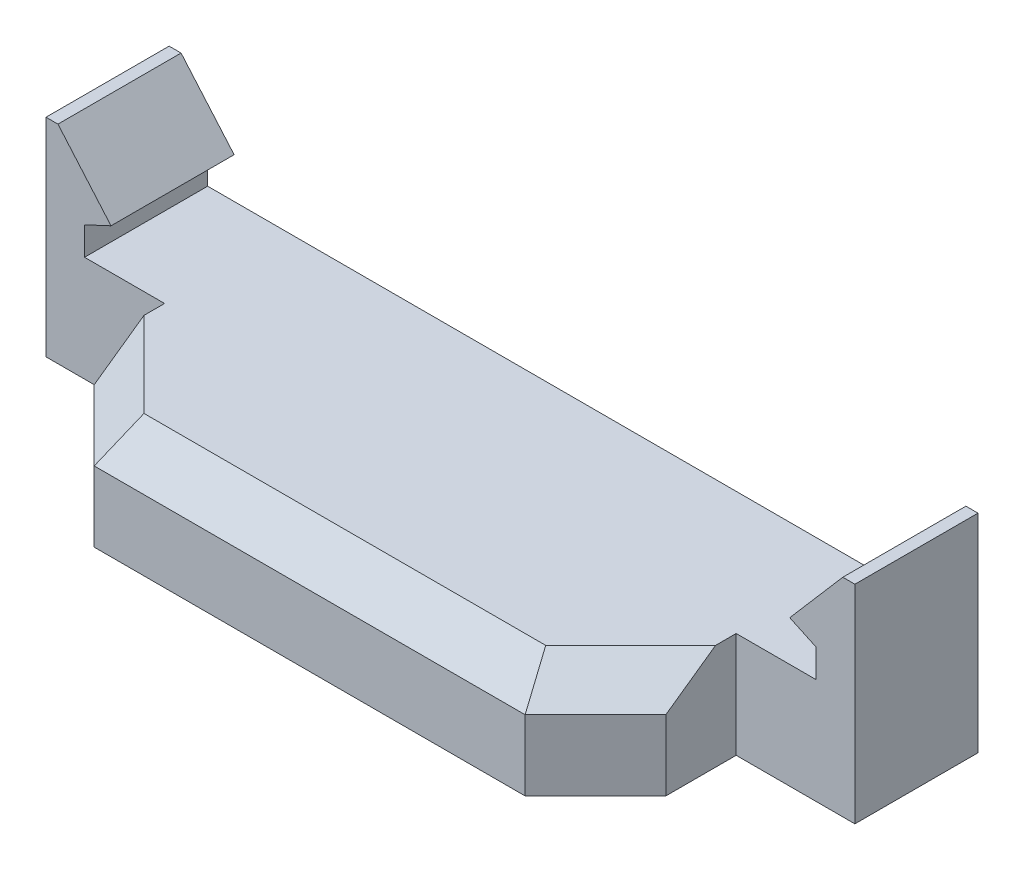
ISO-10303-21;
HEADER;
FILE_DESCRIPTION(('STEP AP214'),'2;1');
FILE_NAME('part.step','',(''),(''),'','','');
FILE_SCHEMA(('AUTOMOTIVE_DESIGN { 1 0 10303 214 1 1 1 1 }'));
ENDSEC;
DATA;
#1=APPLICATION_CONTEXT('core data for automotive mechanical design processes');
#2=APPLICATION_PROTOCOL_DEFINITION('international standard','automotive_design',2000,#1);
#3=PRODUCT_CONTEXT('',#1,'mechanical');
#4=PRODUCT('Part','Part','',(#3));
#5=PRODUCT_RELATED_PRODUCT_CATEGORY('part','',(#4));
#6=PRODUCT_DEFINITION_FORMATION('','',#4);
#7=PRODUCT_DEFINITION_CONTEXT('part definition',#1,'design');
#8=PRODUCT_DEFINITION('design','',#6,#7);
#9=PRODUCT_DEFINITION_SHAPE('','',#8);
#10=(LENGTH_UNIT() NAMED_UNIT(*) SI_UNIT(.MILLI.,.METRE.));
#11=(NAMED_UNIT(*) PLANE_ANGLE_UNIT() SI_UNIT($,.RADIAN.));
#12=(NAMED_UNIT(*) SI_UNIT($,.STERADIAN.) SOLID_ANGLE_UNIT());
#13=UNCERTAINTY_MEASURE_WITH_UNIT(LENGTH_MEASURE(1.E-05),#10,'distance_accuracy_value','');
#14=(GEOMETRIC_REPRESENTATION_CONTEXT(3) GLOBAL_UNCERTAINTY_ASSIGNED_CONTEXT((#13)) GLOBAL_UNIT_ASSIGNED_CONTEXT((#10,
#11,#12)) REPRESENTATION_CONTEXT('',''));
#15=CARTESIAN_POINT('',(0.,0.,0.));
#16=DIRECTION('',(0.,0.,1.));
#17=DIRECTION('',(1.,0.,0.));
#18=AXIS2_PLACEMENT_3D('',#15,#16,#17);
#19=CARTESIAN_POINT('',(0.,0.,3.5));
#20=DIRECTION('',(0.,0.,1.));
#21=DIRECTION('',(1.,0.,0.));
#22=AXIS2_PLACEMENT_3D('',#19,#20,#21);
#23=PLANE('',#22);
#24=DIRECTION('',(0.,1.,0.));
#25=VECTOR('',#24,1.);
#26=CARTESIAN_POINT('',(8.125,1.5,3.5));
#27=LINE('',#26,#25);
#28=CARTESIAN_POINT('',(8.125,-1.5,3.5));
#29=VERTEX_POINT('',#28);
#30=CARTESIAN_POINT('',(8.125,1.5,3.5));
#31=VERTEX_POINT('',#30);
#32=EDGE_CURVE('E212',#29,#31,#27,.T.);
#33=ORIENTED_EDGE('',*,*,#32,.F.);
#34=DIRECTION('',(1.,0.,0.));
#35=VECTOR('',#34,1.);
#36=CARTESIAN_POINT('',(0.,-1.5,3.5));
#37=LINE('',#36,#35);
#38=CARTESIAN_POINT('',(11.5,-1.5,3.5));
#39=VERTEX_POINT('',#38);
#40=EDGE_CURVE('E206',#29,#39,#37,.T.);
#41=ORIENTED_EDGE('',*,*,#40,.T.);
#42=DIRECTION('',(0.,-1.,0.));
#43=VECTOR('',#42,1.);
#44=CARTESIAN_POINT('',(11.5,4.40056886797164,3.5));
#45=LINE('',#44,#43);
#46=CARTESIAN_POINT('',(11.5,4.40056886797164,3.5));
#47=VERTEX_POINT('',#46);
#48=EDGE_CURVE('E249',#47,#39,#45,.T.);
#49=ORIENTED_EDGE('',*,*,#48,.F.);
#50=DIRECTION('',(1.,0.,0.));
#51=VECTOR('',#50,1.);
#52=CARTESIAN_POINT('',(0.,4.40056886797164,3.5));
#53=LINE('',#52,#51);
#54=CARTESIAN_POINT('',(11.1560620483073,4.40056886797164,3.5));
#55=VERTEX_POINT('',#54);
#56=EDGE_CURVE('E205',#55,#47,#53,.T.);
#57=ORIENTED_EDGE('',*,*,#56,.F.);
#58=DIRECTION('',(-0.652740475198616,-0.757581594310134,0.));
#59=VECTOR('',#58,1.);
#60=CARTESIAN_POINT('',(4.22669760880757,-3.64176826155107,3.5));
#61=LINE('',#60,#59);
#62=CARTESIAN_POINT('',(9.64823155059847,2.65055538511523,3.5));
#63=VERTEX_POINT('',#62);
#64=EDGE_CURVE('E257',#55,#63,#61,.T.);
#65=ORIENTED_EDGE('',*,*,#64,.T.);
#66=DIRECTION('',(0.906307787036653,-0.422618261740694,0.));
#67=VECTOR('',#66,1.);
#68=CARTESIAN_POINT('',(2.73845553921676,5.87263685535817,3.5));
#69=LINE('',#68,#67);
#70=CARTESIAN_POINT('',(10.4,2.3,3.5));
#71=VERTEX_POINT('',#70);
#72=EDGE_CURVE('E260',#63,#71,#69,.T.);
#73=ORIENTED_EDGE('',*,*,#72,.T.);
#74=DIRECTION('',(0.,-1.,0.));
#75=VECTOR('',#74,1.);
#76=CARTESIAN_POINT('',(10.4,0.,3.5));
#77=LINE('',#76,#75);
#78=CARTESIAN_POINT('',(10.4,1.5,3.5));
#79=VERTEX_POINT('',#78);
#80=EDGE_CURVE('E263',#71,#79,#77,.T.);
#81=ORIENTED_EDGE('',*,*,#80,.T.);
#82=DIRECTION('',(1.,0.,0.));
#83=VECTOR('',#82,1.);
#84=CARTESIAN_POINT('',(0.,1.5,3.5));
#85=LINE('',#84,#83);
#86=EDGE_CURVE('E267',#31,#79,#85,.T.);
#87=ORIENTED_EDGE('',*,*,#86,.F.);
#88=EDGE_LOOP('',(#33,#41,#49,#57,#65,#73,#81,#87));
#89=FACE_BOUND('',#88,.T.);
#90=ADVANCED_FACE('F41',(#89),#23,.T.);
#91=CARTESIAN_POINT('',(0.,-1.5,3.5));
#92=DIRECTION('',(0.,1.,0.));
#93=DIRECTION('',(0.,0.,1.));
#94=AXIS2_PLACEMENT_3D('',#91,#92,#93);
#95=PLANE('',#94);
#96=DIRECTION('',(1.,0.,0.));
#97=VECTOR('',#96,1.);
#98=CARTESIAN_POINT('',(-8.125,-1.5,7.5));
#99=LINE('',#98,#97);
#100=CARTESIAN_POINT('',(-6.125,-1.5,7.5));
#101=VERTEX_POINT('',#100);
#102=CARTESIAN_POINT('',(6.125,-1.5,7.5));
#103=VERTEX_POINT('',#102);
#104=EDGE_CURVE('E211',#101,#103,#99,.T.);
#105=ORIENTED_EDGE('',*,*,#104,.F.);
#106=DIRECTION('',(-0.707106781186546,0.,-0.707106781186549));
#107=VECTOR('',#106,1.);
#108=CARTESIAN_POINT('',(-6.125,-1.5,7.5));
#109=LINE('',#108,#107);
#110=CARTESIAN_POINT('',(-8.125,-1.5,5.49999999999999));
#111=VERTEX_POINT('',#110);
#112=EDGE_CURVE('E188',#101,#111,#109,.T.);
#113=ORIENTED_EDGE('',*,*,#112,.T.);
#114=DIRECTION('',(0.,0.,-1.));
#115=VECTOR('',#114,1.);
#116=CARTESIAN_POINT('',(-8.125,-1.5,7.5));
#117=LINE('',#116,#115);
#118=CARTESIAN_POINT('',(-8.125,-1.5,3.5));
#119=VERTEX_POINT('',#118);
#120=EDGE_CURVE('E181',#111,#119,#117,.T.);
#121=ORIENTED_EDGE('',*,*,#120,.T.);
#122=CARTESIAN_POINT('',(-11.496,-1.49999999999999,3.5));
#123=VERTEX_POINT('',#122);
#124=EDGE_CURVE('E186',#123,#119,#37,.T.);
#125=ORIENTED_EDGE('',*,*,#124,.F.);
#126=DIRECTION('',(0.,0.,1.));
#127=VECTOR('',#126,1.);
#128=CARTESIAN_POINT('',(-11.496,-1.49999999999999,0.));
#129=LINE('',#128,#127);
#130=CARTESIAN_POINT('',(-11.496,-1.49999999999999,0.));
#131=VERTEX_POINT('',#130);
#132=EDGE_CURVE('E234',#131,#123,#129,.T.);
#133=ORIENTED_EDGE('',*,*,#132,.F.);
#134=DIRECTION('',(1.,0.,0.));
#135=VECTOR('',#134,1.);
#136=CARTESIAN_POINT('',(0.,-1.5,0.));
#137=LINE('',#136,#135);
#138=CARTESIAN_POINT('',(11.5,-1.5,0.));
#139=VERTEX_POINT('',#138);
#140=EDGE_CURVE('E252',#131,#139,#137,.T.);
#141=ORIENTED_EDGE('',*,*,#140,.T.);
#142=DIRECTION('',(0.,0.,-1.));
#143=VECTOR('',#142,1.);
#144=CARTESIAN_POINT('',(11.5,-1.5,3.5));
#145=LINE('',#144,#143);
#146=EDGE_CURVE('E239',#39,#139,#145,.T.);
#147=ORIENTED_EDGE('',*,*,#146,.F.);
#148=ORIENTED_EDGE('',*,*,#40,.F.);
#149=DIRECTION('',(0.,0.,-1.));
#150=VECTOR('',#149,1.);
#151=CARTESIAN_POINT('',(8.125,-1.5,7.5));
#152=LINE('',#151,#150);
#153=CARTESIAN_POINT('',(8.125,-1.5,5.49999999999999));
#154=VERTEX_POINT('',#153);
#155=EDGE_CURVE('E193',#154,#29,#152,.T.);
#156=ORIENTED_EDGE('',*,*,#155,.F.);
#157=DIRECTION('',(-0.707106781186546,0.,0.707106781186549));
#158=VECTOR('',#157,1.);
#159=CARTESIAN_POINT('',(6.125,-1.5,7.5));
#160=LINE('',#159,#158);
#161=EDGE_CURVE('E354',#154,#103,#160,.T.);
#162=ORIENTED_EDGE('',*,*,#161,.T.);
#163=EDGE_LOOP('',(#105,#113,#121,#125,#133,#141,#147,#148,#156,#162));
#164=FACE_BOUND('',#163,.T.);
#165=ADVANCED_FACE('F184',(#164),#95,.F.);
#166=DIRECTION('',(0.,-1.,0.));
#167=VECTOR('',#166,1.);
#168=CARTESIAN_POINT('',(-8.125,1.5,3.5));
#169=LINE('',#168,#167);
#170=CARTESIAN_POINT('',(-8.125,1.5,3.5));
#171=VERTEX_POINT('',#170);
#172=EDGE_CURVE('E200',#171,#119,#169,.T.);
#173=ORIENTED_EDGE('',*,*,#172,.F.);
#174=CARTESIAN_POINT('',(-10.4,1.5,3.5));
#175=VERTEX_POINT('',#174);
#176=EDGE_CURVE('E268',#175,#171,#85,.T.);
#177=ORIENTED_EDGE('',*,*,#176,.F.);
#178=DIRECTION('',(0.,-1.,0.));
#179=VECTOR('',#178,1.);
#180=CARTESIAN_POINT('',(-10.4,0.,3.5));
#181=LINE('',#180,#179);
#182=CARTESIAN_POINT('',(-10.4,2.3,3.5));
#183=VERTEX_POINT('',#182);
#184=EDGE_CURVE('E271',#183,#175,#181,.T.);
#185=ORIENTED_EDGE('',*,*,#184,.F.);
#186=DIRECTION('',(-0.906307787036651,-0.422618261740697,0.));
#187=VECTOR('',#186,1.);
#188=CARTESIAN_POINT('',(-2.73845553921679,5.87263685535819,3.5));
#189=LINE('',#188,#187);
#190=CARTESIAN_POINT('',(-9.64823155059847,2.65055538511523,3.5));
#191=VERTEX_POINT('',#190);
#192=EDGE_CURVE('E275',#191,#183,#189,.T.);
#193=ORIENTED_EDGE('',*,*,#192,.F.);
#194=DIRECTION('',(0.652740475198616,-0.757581594310134,0.));
#195=VECTOR('',#194,1.);
#196=CARTESIAN_POINT('',(-4.22669760880758,-3.64176826155108,3.5));
#197=LINE('',#196,#195);
#198=CARTESIAN_POINT('',(-11.1560620483073,4.40056886797164,3.5));
#199=VERTEX_POINT('',#198);
#200=EDGE_CURVE('E279',#199,#191,#197,.T.);
#201=ORIENTED_EDGE('',*,*,#200,.F.);
#202=DIRECTION('',(-1.,0.,0.));
#203=VECTOR('',#202,1.);
#204=CARTESIAN_POINT('',(0.,4.40056886797155,3.5));
#205=LINE('',#204,#203);
#206=CARTESIAN_POINT('',(-11.496,4.40056886797165,3.5));
#207=VERTEX_POINT('',#206);
#208=EDGE_CURVE('E283',#199,#207,#205,.T.);
#209=ORIENTED_EDGE('',*,*,#208,.T.);
#210=DIRECTION('',(0.,1.,0.));
#211=VECTOR('',#210,1.);
#212=CARTESIAN_POINT('',(-11.496,-1.49999999999999,3.5));
#213=LINE('',#212,#211);
#214=EDGE_CURVE('E203',#123,#207,#213,.T.);
#215=ORIENTED_EDGE('',*,*,#214,.F.);
#216=ORIENTED_EDGE('',*,*,#124,.T.);
#217=EDGE_LOOP('',(#173,#177,#185,#193,#201,#209,#215,#216));
#218=FACE_BOUND('',#217,.T.);
#219=ADVANCED_FACE('F198',(#218),#23,.T.);
#220=CARTESIAN_POINT('',(0.,0.,0.));
#221=DIRECTION('',(0.,0.,1.));
#222=DIRECTION('',(1.,0.,0.));
#223=AXIS2_PLACEMENT_3D('',#220,#221,#222);
#224=PLANE('',#223);
#225=DIRECTION('',(0.,-1.,0.));
#226=VECTOR('',#225,1.);
#227=CARTESIAN_POINT('',(-11.496,4.40056886797165,0.));
#228=LINE('',#227,#226);
#229=CARTESIAN_POINT('',(-11.496,4.40056886797165,0.));
#230=VERTEX_POINT('',#229);
#231=EDGE_CURVE('E231',#230,#131,#228,.T.);
#232=ORIENTED_EDGE('',*,*,#231,.F.);
#233=DIRECTION('',(-1.,0.,0.));
#234=VECTOR('',#233,1.);
#235=CARTESIAN_POINT('',(0.,4.40056886797155,0.));
#236=LINE('',#235,#234);
#237=CARTESIAN_POINT('',(-11.1560620483073,4.40056886797164,0.));
#238=VERTEX_POINT('',#237);
#239=EDGE_CURVE('E319',#238,#230,#236,.T.);
#240=ORIENTED_EDGE('',*,*,#239,.F.);
#241=DIRECTION('',(0.652740475198616,-0.757581594310134,0.));
#242=VECTOR('',#241,1.);
#243=CARTESIAN_POINT('',(-4.22669760880758,-3.64176826155108,0.));
#244=LINE('',#243,#242);
#245=CARTESIAN_POINT('',(-9.64823155059847,2.65055538511523,0.));
#246=VERTEX_POINT('',#245);
#247=EDGE_CURVE('E315',#238,#246,#244,.T.);
#248=ORIENTED_EDGE('',*,*,#247,.T.);
#249=DIRECTION('',(-0.906307787036651,-0.422618261740697,0.));
#250=VECTOR('',#249,1.);
#251=CARTESIAN_POINT('',(-2.73845553921679,5.87263685535819,0.));
#252=LINE('',#251,#250);
#253=CARTESIAN_POINT('',(-10.4,2.3,0.));
#254=VERTEX_POINT('',#253);
#255=EDGE_CURVE('E311',#246,#254,#252,.T.);
#256=ORIENTED_EDGE('',*,*,#255,.T.);
#257=DIRECTION('',(0.,-1.,0.));
#258=VECTOR('',#257,1.);
#259=CARTESIAN_POINT('',(-10.4,0.,0.));
#260=LINE('',#259,#258);
#261=CARTESIAN_POINT('',(-10.4,1.5,0.));
#262=VERTEX_POINT('',#261);
#263=EDGE_CURVE('E307',#254,#262,#260,.T.);
#264=ORIENTED_EDGE('',*,*,#263,.T.);
#265=DIRECTION('',(1.,0.,0.));
#266=VECTOR('',#265,1.);
#267=CARTESIAN_POINT('',(0.,1.5,0.));
#268=LINE('',#267,#266);
#269=CARTESIAN_POINT('',(10.4,1.5,0.));
#270=VERTEX_POINT('',#269);
#271=EDGE_CURVE('E303',#262,#270,#268,.T.);
#272=ORIENTED_EDGE('',*,*,#271,.T.);
#273=DIRECTION('',(0.,-1.,0.));
#274=VECTOR('',#273,1.);
#275=CARTESIAN_POINT('',(10.4,0.,0.));
#276=LINE('',#275,#274);
#277=CARTESIAN_POINT('',(10.4,2.3,0.));
#278=VERTEX_POINT('',#277);
#279=EDGE_CURVE('E299',#278,#270,#276,.T.);
#280=ORIENTED_EDGE('',*,*,#279,.F.);
#281=DIRECTION('',(0.906307787036653,-0.422618261740694,0.));
#282=VECTOR('',#281,1.);
#283=CARTESIAN_POINT('',(2.73845553921676,5.87263685535817,0.));
#284=LINE('',#283,#282);
#285=CARTESIAN_POINT('',(9.64823155059847,2.65055538511523,0.));
#286=VERTEX_POINT('',#285);
#287=EDGE_CURVE('E296',#286,#278,#284,.T.);
#288=ORIENTED_EDGE('',*,*,#287,.F.);
#289=DIRECTION('',(-0.652740475198616,-0.757581594310134,0.));
#290=VECTOR('',#289,1.);
#291=CARTESIAN_POINT('',(4.22669760880757,-3.64176826155107,0.));
#292=LINE('',#291,#290);
#293=CARTESIAN_POINT('',(11.1560620483073,4.40056886797164,0.));
#294=VERTEX_POINT('',#293);
#295=EDGE_CURVE('E293',#294,#286,#292,.T.);
#296=ORIENTED_EDGE('',*,*,#295,.F.);
#297=DIRECTION('',(1.,0.,0.));
#298=VECTOR('',#297,1.);
#299=CARTESIAN_POINT('',(0.,4.40056886797164,0.));
#300=LINE('',#299,#298);
#301=CARTESIAN_POINT('',(11.5,4.40056886797164,0.));
#302=VERTEX_POINT('',#301);
#303=EDGE_CURVE('E289',#294,#302,#300,.T.);
#304=ORIENTED_EDGE('',*,*,#303,.T.);
#305=DIRECTION('',(0.,1.,0.));
#306=VECTOR('',#305,1.);
#307=CARTESIAN_POINT('',(11.5,-1.5,0.));
#308=LINE('',#307,#306);
#309=EDGE_CURVE('E243',#139,#302,#308,.T.);
#310=ORIENTED_EDGE('',*,*,#309,.F.);
#311=ORIENTED_EDGE('',*,*,#140,.F.);
#312=EDGE_LOOP('',(#232,#240,#248,#256,#264,#272,#280,#288,#296,#304,#310,#311));
#313=FACE_BOUND('',#312,.T.);
#314=ADVANCED_FACE('F425',(#313),#224,.F.);
#315=CARTESIAN_POINT('',(0.,4.40056886797155,3.5));
#316=DIRECTION('',(0.,-1.,0.));
#317=DIRECTION('',(1.,0.,0.));
#318=AXIS2_PLACEMENT_3D('',#315,#316,#317);
#319=PLANE('',#318);
#320=DIRECTION('',(0.,0.,-1.));
#321=VECTOR('',#320,1.);
#322=CARTESIAN_POINT('',(-11.496,4.40056886797165,3.5));
#323=LINE('',#322,#321);
#324=EDGE_CURVE('E228',#207,#230,#323,.T.);
#325=ORIENTED_EDGE('',*,*,#324,.F.);
#326=ORIENTED_EDGE('',*,*,#208,.F.);
#327=DIRECTION('',(0.,0.,-1.));
#328=VECTOR('',#327,1.);
#329=CARTESIAN_POINT('',(-11.1560620483073,4.40056886797164,3.5));
#330=LINE('',#329,#328);
#331=EDGE_CURVE('E286',#199,#238,#330,.T.);
#332=ORIENTED_EDGE('',*,*,#331,.T.);
#333=ORIENTED_EDGE('',*,*,#239,.T.);
#334=EDGE_LOOP('',(#325,#326,#332,#333));
#335=FACE_BOUND('',#334,.T.);
#336=ADVANCED_FACE('F419',(#335),#319,.F.);
#337=CARTESIAN_POINT('',(0.,4.40056886797164,3.5));
#338=DIRECTION('',(0.,1.,0.));
#339=DIRECTION('',(0.,0.,1.));
#340=AXIS2_PLACEMENT_3D('',#337,#338,#339);
#341=PLANE('',#340);
#342=ORIENTED_EDGE('',*,*,#56,.T.);
#343=DIRECTION('',(0.,0.,1.));
#344=VECTOR('',#343,1.);
#345=CARTESIAN_POINT('',(11.5,4.40056886797164,0.));
#346=LINE('',#345,#344);
#347=EDGE_CURVE('E246',#302,#47,#346,.T.);
#348=ORIENTED_EDGE('',*,*,#347,.F.);
#349=ORIENTED_EDGE('',*,*,#303,.F.);
#350=DIRECTION('',(0.,0.,-1.));
#351=VECTOR('',#350,1.);
#352=CARTESIAN_POINT('',(11.1560620483073,4.40056886797164,3.5));
#353=LINE('',#352,#351);
#354=EDGE_CURVE('E345',#55,#294,#353,.T.);
#355=ORIENTED_EDGE('',*,*,#354,.F.);
#356=EDGE_LOOP('',(#342,#348,#349,#355));
#357=FACE_BOUND('',#356,.T.);
#358=ADVANCED_FACE('F437',(#357),#341,.T.);
#359=CARTESIAN_POINT('',(4.22669760880757,-3.64176826155107,3.5));
#360=DIRECTION('',(0.757581594310134,-0.652740475198616,0.));
#361=DIRECTION('',(0.652740475198616,0.757581594310135,0.));
#362=AXIS2_PLACEMENT_3D('',#359,#360,#361);
#363=PLANE('',#362);
#364=ORIENTED_EDGE('',*,*,#295,.T.);
#365=DIRECTION('',(0.,0.,-1.));
#366=VECTOR('',#365,1.);
#367=CARTESIAN_POINT('',(9.64823155059847,2.65055538511523,3.5));
#368=LINE('',#367,#366);
#369=EDGE_CURVE('E341',#63,#286,#368,.T.);
#370=ORIENTED_EDGE('',*,*,#369,.F.);
#371=ORIENTED_EDGE('',*,*,#64,.F.);
#372=ORIENTED_EDGE('',*,*,#354,.T.);
#373=EDGE_LOOP('',(#364,#370,#371,#372));
#374=FACE_BOUND('',#373,.T.);
#375=ADVANCED_FACE('F443',(#374),#363,.F.);
#376=CARTESIAN_POINT('',(2.73845553921676,5.87263685535817,3.5));
#377=DIRECTION('',(0.422618261740694,0.906307787036653,0.));
#378=DIRECTION('',(-0.906307787036653,0.422618261740694,0.));
#379=AXIS2_PLACEMENT_3D('',#376,#377,#378);
#380=PLANE('',#379);
#381=ORIENTED_EDGE('',*,*,#287,.T.);
#382=DIRECTION('',(0.,0.,-1.));
#383=VECTOR('',#382,1.);
#384=CARTESIAN_POINT('',(10.4,2.3,3.5));
#385=LINE('',#384,#383);
#386=EDGE_CURVE('E337',#71,#278,#385,.T.);
#387=ORIENTED_EDGE('',*,*,#386,.F.);
#388=ORIENTED_EDGE('',*,*,#72,.F.);
#389=ORIENTED_EDGE('',*,*,#369,.T.);
#390=EDGE_LOOP('',(#381,#387,#388,#389));
#391=FACE_BOUND('',#390,.T.);
#392=ADVANCED_FACE('F450',(#391),#380,.F.);
#393=CARTESIAN_POINT('',(10.4,0.,3.5));
#394=DIRECTION('',(1.,0.,0.));
#395=DIRECTION('',(0.,0.,-1.));
#396=AXIS2_PLACEMENT_3D('',#393,#394,#395);
#397=PLANE('',#396);
#398=ORIENTED_EDGE('',*,*,#279,.T.);
#399=DIRECTION('',(0.,0.,-1.));
#400=VECTOR('',#399,1.);
#401=CARTESIAN_POINT('',(10.4,1.5,3.5));
#402=LINE('',#401,#400);
#403=EDGE_CURVE('E334',#79,#270,#402,.T.);
#404=ORIENTED_EDGE('',*,*,#403,.F.);
#405=ORIENTED_EDGE('',*,*,#80,.F.);
#406=ORIENTED_EDGE('',*,*,#386,.T.);
#407=EDGE_LOOP('',(#398,#404,#405,#406));
#408=FACE_BOUND('',#407,.T.);
#409=ADVANCED_FACE('F454',(#408),#397,.F.);
#410=CARTESIAN_POINT('',(0.,1.5,3.5));
#411=DIRECTION('',(0.,1.,0.));
#412=DIRECTION('',(0.,0.,1.));
#413=AXIS2_PLACEMENT_3D('',#410,#411,#412);
#414=PLANE('',#413);
#415=DIRECTION('',(1.,0.,0.));
#416=VECTOR('',#415,1.);
#417=CARTESIAN_POINT('',(0.,1.5,6.49999999999999));
#418=LINE('',#417,#416);
#419=CARTESIAN_POINT('',(-5.7107864376269,1.5,6.49999999999999));
#420=VERTEX_POINT('',#419);
#421=CARTESIAN_POINT('',(5.7107864376269,1.5,6.49999999999999));
#422=VERTEX_POINT('',#421);
#423=EDGE_CURVE('E365',#420,#422,#418,.T.);
#424=ORIENTED_EDGE('',*,*,#423,.T.);
#425=DIRECTION('',(0.707106781186546,0.,-0.707106781186549));
#426=VECTOR('',#425,1.);
#427=CARTESIAN_POINT('',(4.35539321881345,1.5,7.85539321881344));
#428=LINE('',#427,#426);
#429=CARTESIAN_POINT('',(8.125,1.5,4.08578643762688));
#430=VERTEX_POINT('',#429);
#431=EDGE_CURVE('E371',#422,#430,#428,.T.);
#432=ORIENTED_EDGE('',*,*,#431,.T.);
#433=DIRECTION('',(0.,0.,-1.));
#434=VECTOR('',#433,1.);
#435=CARTESIAN_POINT('',(8.125,1.5,7.5));
#436=LINE('',#435,#434);
#437=EDGE_CURVE('E225',#430,#31,#436,.T.);
#438=ORIENTED_EDGE('',*,*,#437,.T.);
#439=ORIENTED_EDGE('',*,*,#86,.T.);
#440=ORIENTED_EDGE('',*,*,#403,.T.);
#441=ORIENTED_EDGE('',*,*,#271,.F.);
#442=DIRECTION('',(0.,0.,-1.));
#443=VECTOR('',#442,1.);
#444=CARTESIAN_POINT('',(-10.4,1.5,3.5));
#445=LINE('',#444,#443);
#446=EDGE_CURVE('E331',#175,#262,#445,.T.);
#447=ORIENTED_EDGE('',*,*,#446,.F.);
#448=ORIENTED_EDGE('',*,*,#176,.T.);
#449=DIRECTION('',(0.,0.,-1.));
#450=VECTOR('',#449,1.);
#451=CARTESIAN_POINT('',(-8.125,1.5,7.5));
#452=LINE('',#451,#450);
#453=CARTESIAN_POINT('',(-8.125,1.5,4.08578643762688));
#454=VERTEX_POINT('',#453);
#455=EDGE_CURVE('E192',#454,#171,#452,.T.);
#456=ORIENTED_EDGE('',*,*,#455,.F.);
#457=DIRECTION('',(0.707106781186546,0.,0.707106781186549));
#458=VECTOR('',#457,1.);
#459=CARTESIAN_POINT('',(-4.35539321881345,1.5,7.85539321881344));
#460=LINE('',#459,#458);
#461=EDGE_CURVE('E368',#454,#420,#460,.T.);
#462=ORIENTED_EDGE('',*,*,#461,.T.);
#463=EDGE_LOOP('',(#424,#432,#438,#439,#440,#441,#447,#448,#456,#462));
#464=FACE_BOUND('',#463,.T.);
#465=ADVANCED_FACE('F401',(#464),#414,.T.);
#466=CARTESIAN_POINT('',(-10.4,0.,3.5));
#467=DIRECTION('',(1.,0.,0.));
#468=DIRECTION('',(0.,0.,-1.));
#469=AXIS2_PLACEMENT_3D('',#466,#467,#468);
#470=PLANE('',#469);
#471=ORIENTED_EDGE('',*,*,#263,.F.);
#472=DIRECTION('',(0.,0.,-1.));
#473=VECTOR('',#472,1.);
#474=CARTESIAN_POINT('',(-10.4,2.3,3.5));
#475=LINE('',#474,#473);
#476=EDGE_CURVE('E328',#183,#254,#475,.T.);
#477=ORIENTED_EDGE('',*,*,#476,.F.);
#478=ORIENTED_EDGE('',*,*,#184,.T.);
#479=ORIENTED_EDGE('',*,*,#446,.T.);
#480=EDGE_LOOP('',(#471,#477,#478,#479));
#481=FACE_BOUND('',#480,.T.);
#482=ADVANCED_FACE('F407',(#481),#470,.T.);
#483=CARTESIAN_POINT('',(-2.73845553921679,5.87263685535819,3.5));
#484=DIRECTION('',(0.422618261740697,-0.906307787036651,0.));
#485=DIRECTION('',(0.906307787036651,0.422618261740697,0.));
#486=AXIS2_PLACEMENT_3D('',#483,#484,#485);
#487=PLANE('',#486);
#488=ORIENTED_EDGE('',*,*,#255,.F.);
#489=DIRECTION('',(0.,0.,-1.));
#490=VECTOR('',#489,1.);
#491=CARTESIAN_POINT('',(-9.64823155059847,2.65055538511523,3.5));
#492=LINE('',#491,#490);
#493=EDGE_CURVE('E325',#191,#246,#492,.T.);
#494=ORIENTED_EDGE('',*,*,#493,.F.);
#495=ORIENTED_EDGE('',*,*,#192,.T.);
#496=ORIENTED_EDGE('',*,*,#476,.T.);
#497=EDGE_LOOP('',(#488,#494,#495,#496));
#498=FACE_BOUND('',#497,.T.);
#499=ADVANCED_FACE('F410',(#498),#487,.T.);
#500=CARTESIAN_POINT('',(-4.22669760880758,-3.64176826155108,3.5));
#501=DIRECTION('',(0.757581594310134,0.652740475198616,0.));
#502=DIRECTION('',(-0.652740475198616,0.757581594310135,0.));
#503=AXIS2_PLACEMENT_3D('',#500,#501,#502);
#504=PLANE('',#503);
#505=ORIENTED_EDGE('',*,*,#247,.F.);
#506=ORIENTED_EDGE('',*,*,#331,.F.);
#507=ORIENTED_EDGE('',*,*,#200,.T.);
#508=ORIENTED_EDGE('',*,*,#493,.T.);
#509=EDGE_LOOP('',(#505,#506,#507,#508));
#510=FACE_BOUND('',#509,.T.);
#511=ADVANCED_FACE('F414',(#510),#504,.T.);
#512=CARTESIAN_POINT('',(11.5,0.,0.));
#513=DIRECTION('',(1.,0.,0.));
#514=DIRECTION('',(0.,0.,-1.));
#515=AXIS2_PLACEMENT_3D('',#512,#513,#514);
#516=PLANE('',#515);
#517=ORIENTED_EDGE('',*,*,#146,.T.);
#518=ORIENTED_EDGE('',*,*,#309,.T.);
#519=ORIENTED_EDGE('',*,*,#347,.T.);
#520=ORIENTED_EDGE('',*,*,#48,.T.);
#521=EDGE_LOOP('',(#517,#518,#519,#520));
#522=FACE_BOUND('',#521,.T.);
#523=ADVANCED_FACE('F430',(#522),#516,.T.);
#524=CARTESIAN_POINT('',(-11.496,0.,0.));
#525=DIRECTION('',(-1.,0.,0.));
#526=DIRECTION('',(0.,-1.,0.));
#527=AXIS2_PLACEMENT_3D('',#524,#525,#526);
#528=PLANE('',#527);
#529=ORIENTED_EDGE('',*,*,#324,.T.);
#530=ORIENTED_EDGE('',*,*,#231,.T.);
#531=ORIENTED_EDGE('',*,*,#132,.T.);
#532=ORIENTED_EDGE('',*,*,#214,.T.);
#533=EDGE_LOOP('',(#529,#530,#531,#532));
#534=FACE_BOUND('',#533,.T.);
#535=ADVANCED_FACE('F422',(#534),#528,.T.);
#536=CARTESIAN_POINT('',(8.125,1.5,7.5));
#537=DIRECTION('',(-1.,0.,0.));
#538=DIRECTION('',(0.,0.,1.));
#539=AXIS2_PLACEMENT_3D('',#536,#537,#538);
#540=PLANE('',#539);
#541=ORIENTED_EDGE('',*,*,#437,.F.);
#542=DIRECTION('',(0.,0.577350269189622,-0.816496580927728));
#543=VECTOR('',#542,1.);
#544=CARTESIAN_POINT('',(8.125,-0.27700967825587,6.5988576250846));
#545=LINE('',#544,#543);
#546=CARTESIAN_POINT('',(8.125,0.499999999999996,5.49999999999999));
#547=VERTEX_POINT('',#546);
#548=EDGE_CURVE('E375',#430,#547,#545,.F.);
#549=ORIENTED_EDGE('',*,*,#548,.T.);
#550=DIRECTION('',(0.,-1.,0.));
#551=VECTOR('',#550,1.);
#552=CARTESIAN_POINT('',(8.125,-1.5,5.49999999999999));
#553=LINE('',#552,#551);
#554=EDGE_CURVE('E362',#547,#154,#553,.T.);
#555=ORIENTED_EDGE('',*,*,#554,.T.);
#556=ORIENTED_EDGE('',*,*,#155,.T.);
#557=ORIENTED_EDGE('',*,*,#32,.T.);
#558=EDGE_LOOP('',(#541,#549,#555,#556,#557));
#559=FACE_BOUND('',#558,.T.);
#560=ADVANCED_FACE('F459',(#559),#540,.F.);
#561=CARTESIAN_POINT('',(-8.125,1.5,7.5));
#562=DIRECTION('',(1.,0.,0.));
#563=DIRECTION('',(0.,0.,-1.));
#564=AXIS2_PLACEMENT_3D('',#561,#562,#563);
#565=PLANE('',#564);
#566=DIRECTION('',(0.,1.,0.));
#567=VECTOR('',#566,1.);
#568=CARTESIAN_POINT('',(-8.125,1.5,5.49999999999999));
#569=LINE('',#568,#567);
#570=CARTESIAN_POINT('',(-8.125,0.499999999999995,5.49999999999999));
#571=VERTEX_POINT('',#570);
#572=EDGE_CURVE('E359',#111,#571,#569,.T.);
#573=ORIENTED_EDGE('',*,*,#572,.T.);
#574=DIRECTION('',(0.,-0.577350269189622,0.816496580927728));
#575=VECTOR('',#574,1.);
#576=CARTESIAN_POINT('',(-8.125,-0.27700967825587,6.5988576250846));
#577=LINE('',#576,#575);
#578=EDGE_CURVE('E51',#571,#454,#577,.F.);
#579=ORIENTED_EDGE('',*,*,#578,.T.);
#580=ORIENTED_EDGE('',*,*,#455,.T.);
#581=ORIENTED_EDGE('',*,*,#172,.T.);
#582=ORIENTED_EDGE('',*,*,#120,.F.);
#583=EDGE_LOOP('',(#573,#579,#580,#581,#582));
#584=FACE_BOUND('',#583,.T.);
#585=ADVANCED_FACE('F208',(#584),#565,.F.);
#586=CARTESIAN_POINT('',(0.,0.,7.5));
#587=DIRECTION('',(0.,0.,1.));
#588=DIRECTION('',(1.,0.,0.));
#589=AXIS2_PLACEMENT_3D('',#586,#587,#588);
#590=PLANE('',#589);
#591=DIRECTION('',(0.,1.,0.));
#592=VECTOR('',#591,1.);
#593=CARTESIAN_POINT('',(6.125,1.5,7.5));
#594=LINE('',#593,#592);
#595=CARTESIAN_POINT('',(6.125,0.499999999999996,7.5));
#596=VERTEX_POINT('',#595);
#597=EDGE_CURVE('E348',#103,#596,#594,.T.);
#598=ORIENTED_EDGE('',*,*,#597,.T.);
#599=DIRECTION('',(-1.,0.,0.));
#600=VECTOR('',#599,1.);
#601=CARTESIAN_POINT('',(0.,0.499999999999996,7.5));
#602=LINE('',#601,#600);
#603=CARTESIAN_POINT('',(-6.125,0.499999999999996,7.5));
#604=VERTEX_POINT('',#603);
#605=EDGE_CURVE('E11',#596,#604,#602,.T.);
#606=ORIENTED_EDGE('',*,*,#605,.T.);
#607=DIRECTION('',(0.,-1.,0.));
#608=VECTOR('',#607,1.);
#609=CARTESIAN_POINT('',(-6.125,-1.5,7.5));
#610=LINE('',#609,#608);
#611=EDGE_CURVE('E351',#604,#101,#610,.T.);
#612=ORIENTED_EDGE('',*,*,#611,.T.);
#613=ORIENTED_EDGE('',*,*,#104,.T.);
#614=EDGE_LOOP('',(#598,#606,#612,#613));
#615=FACE_BOUND('',#614,.T.);
#616=ADVANCED_FACE('F466',(#615),#590,.T.);
#617=CARTESIAN_POINT('',(-6.125,0.,7.5));
#618=DIRECTION('',(-0.707106781186549,0.,0.707106781186546));
#619=DIRECTION('',(0.,1.,0.));
#620=AXIS2_PLACEMENT_3D('',#617,#618,#619);
#621=PLANE('',#620);
#622=ORIENTED_EDGE('',*,*,#611,.F.);
#623=DIRECTION('',(-0.707106781186546,0.,-0.707106781186549));
#624=VECTOR('',#623,1.);
#625=CARTESIAN_POINT('',(-6.125,0.499999999999996,7.5));
#626=LINE('',#625,#624);
#627=EDGE_CURVE('E64',#604,#571,#626,.T.);
#628=ORIENTED_EDGE('',*,*,#627,.T.);
#629=ORIENTED_EDGE('',*,*,#572,.F.);
#630=ORIENTED_EDGE('',*,*,#112,.F.);
#631=EDGE_LOOP('',(#622,#628,#629,#630));
#632=FACE_BOUND('',#631,.T.);
#633=ADVANCED_FACE('F467',(#632),#621,.T.);
#634=CARTESIAN_POINT('',(6.125,0.,7.5));
#635=DIRECTION('',(0.707106781186549,0.,0.707106781186546));
#636=DIRECTION('',(0.,-1.,0.));
#637=AXIS2_PLACEMENT_3D('',#634,#635,#636);
#638=PLANE('',#637);
#639=ORIENTED_EDGE('',*,*,#554,.F.);
#640=DIRECTION('',(-0.707106781186546,0.,0.707106781186549));
#641=VECTOR('',#640,1.);
#642=CARTESIAN_POINT('',(6.125,0.499999999999996,7.5));
#643=LINE('',#642,#641);
#644=EDGE_CURVE('E378',#547,#596,#643,.T.);
#645=ORIENTED_EDGE('',*,*,#644,.T.);
#646=ORIENTED_EDGE('',*,*,#597,.F.);
#647=ORIENTED_EDGE('',*,*,#161,.F.);
#648=EDGE_LOOP('',(#639,#645,#646,#647));
#649=FACE_BOUND('',#648,.T.);
#650=ADVANCED_FACE('F465',(#649),#638,.T.);
#651=CARTESIAN_POINT('',(-4.35539321881345,1.5,7.85539321881344));
#652=DIRECTION('',(0.499999999999999,-0.70710678118655,-0.499999999999997));
#653=DIRECTION('',(0.707106781186546,0.,0.707106781186549));
#654=AXIS2_PLACEMENT_3D('',#651,#652,#653);
#655=PLANE('',#654);
#656=ORIENTED_EDGE('',*,*,#578,.F.);
#657=ORIENTED_EDGE('',*,*,#627,.F.);
#658=DIRECTION('',(-0.281084637714822,-0.678598344545844,0.678598344545849));
#659=VECTOR('',#658,1.);
#660=CARTESIAN_POINT('',(-5.64107248694945,1.66830436521209,6.33169563478789));
#661=LINE('',#660,#659);
#662=EDGE_CURVE('E45',#420,#604,#661,.T.);
#663=ORIENTED_EDGE('',*,*,#662,.F.);
#664=ORIENTED_EDGE('',*,*,#461,.F.);
#665=EDGE_LOOP('',(#656,#657,#663,#664));
#666=FACE_BOUND('',#665,.T.);
#667=ADVANCED_FACE('F43',(#666),#655,.F.);
#668=CARTESIAN_POINT('',(0.,0.499999999999996,7.5));
#669=DIRECTION('',(0.,-0.70710678118655,-0.707106781186545));
#670=DIRECTION('',(-1.,0.,0.));
#671=AXIS2_PLACEMENT_3D('',#668,#669,#670);
#672=PLANE('',#671);
#673=ORIENTED_EDGE('',*,*,#662,.T.);
#674=ORIENTED_EDGE('',*,*,#605,.F.);
#675=DIRECTION('',(-0.281084637714822,0.678598344545844,-0.678598344545849));
#676=VECTOR('',#675,1.);
#677=CARTESIAN_POINT('',(5.64107248694945,1.66830436521209,6.33169563478789));
#678=LINE('',#677,#676);
#679=EDGE_CURVE('E384',#422,#596,#678,.F.);
#680=ORIENTED_EDGE('',*,*,#679,.F.);
#681=ORIENTED_EDGE('',*,*,#423,.F.);
#682=EDGE_LOOP('',(#673,#674,#680,#681));
#683=FACE_BOUND('',#682,.T.);
#684=ADVANCED_FACE('F396',(#683),#672,.F.);
#685=CARTESIAN_POINT('',(4.35539321881345,1.5,7.85539321881344));
#686=DIRECTION('',(-0.499999999999999,-0.70710678118655,-0.499999999999997));
#687=DIRECTION('',(0.707106781186546,0.,-0.707106781186549));
#688=AXIS2_PLACEMENT_3D('',#685,#686,#687);
#689=PLANE('',#688);
#690=ORIENTED_EDGE('',*,*,#679,.T.);
#691=ORIENTED_EDGE('',*,*,#644,.F.);
#692=ORIENTED_EDGE('',*,*,#548,.F.);
#693=ORIENTED_EDGE('',*,*,#431,.F.);
#694=EDGE_LOOP('',(#690,#691,#692,#693));
#695=FACE_BOUND('',#694,.T.);
#696=ADVANCED_FACE('F594',(#695),#689,.F.);
#697=CLOSED_SHELL('',(#90,#165,#219,#314,#336,#358,#375,#392,#409,#465,#482,#499,#511,#523,#535,
#560,#585,#616,#633,#650,#667,#684,#696));
#698=MANIFOLD_SOLID_BREP('B2',#697);
#699=ADVANCED_BREP_SHAPE_REPRESENTATION('',(#18,#698),#14);
#700=SHAPE_DEFINITION_REPRESENTATION(#9,#699);
ENDSEC;
END-ISO-10303-21;
